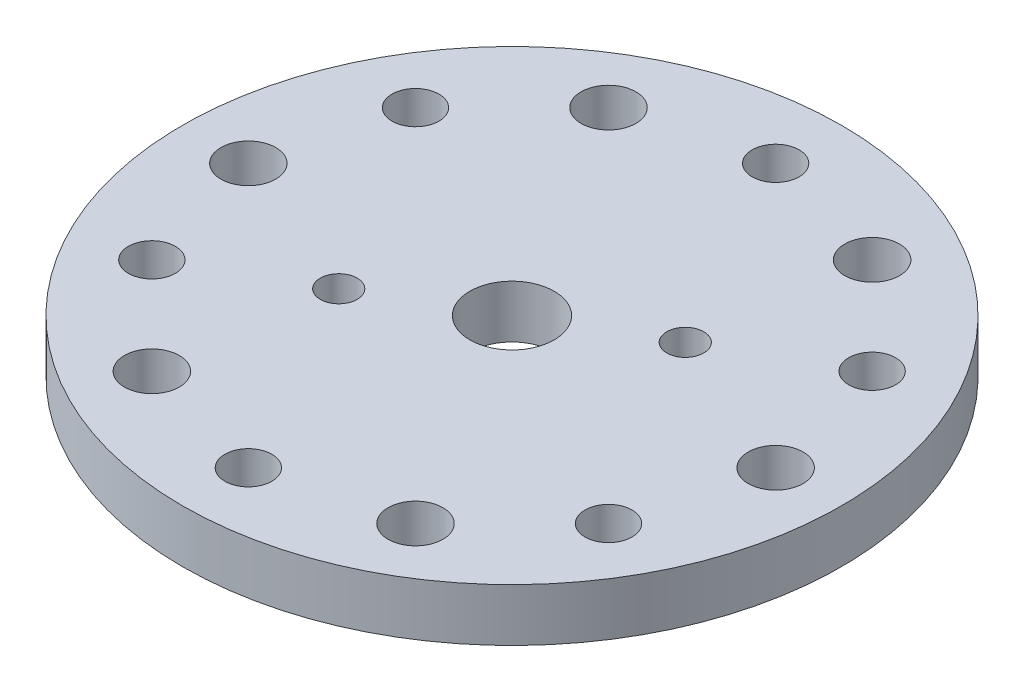
ISO-10303-21;
HEADER;
FILE_DESCRIPTION(('STEP AP214'),'2;1');
FILE_NAME('part.step','',(''),(''),'','','');
FILE_SCHEMA(('AUTOMOTIVE_DESIGN { 1 0 10303 214 1 1 1 1 }'));
ENDSEC;
DATA;
#1=APPLICATION_CONTEXT('core data for automotive mechanical design processes');
#2=APPLICATION_PROTOCOL_DEFINITION('international standard','automotive_design',2000,#1);
#3=PRODUCT_CONTEXT('',#1,'mechanical');
#4=PRODUCT('Part','Part','',(#3));
#5=PRODUCT_RELATED_PRODUCT_CATEGORY('part','',(#4));
#6=PRODUCT_DEFINITION_FORMATION('','',#4);
#7=PRODUCT_DEFINITION_CONTEXT('part definition',#1,'design');
#8=PRODUCT_DEFINITION('design','',#6,#7);
#9=PRODUCT_DEFINITION_SHAPE('','',#8);
#10=(LENGTH_UNIT() NAMED_UNIT(*) SI_UNIT(.MILLI.,.METRE.));
#11=(NAMED_UNIT(*) PLANE_ANGLE_UNIT() SI_UNIT($,.RADIAN.));
#12=(NAMED_UNIT(*) SI_UNIT($,.STERADIAN.) SOLID_ANGLE_UNIT());
#13=UNCERTAINTY_MEASURE_WITH_UNIT(LENGTH_MEASURE(1.E-05),#10,'distance_accuracy_value','');
#14=(GEOMETRIC_REPRESENTATION_CONTEXT(3) GLOBAL_UNCERTAINTY_ASSIGNED_CONTEXT((#13)) GLOBAL_UNIT_ASSIGNED_CONTEXT((#10,
#11,#12)) REPRESENTATION_CONTEXT('',''));
#15=CARTESIAN_POINT('',(0.,0.,0.));
#16=DIRECTION('',(0.,0.,1.));
#17=DIRECTION('',(1.,0.,0.));
#18=AXIS2_PLACEMENT_3D('',#15,#16,#17);
#19=CARTESIAN_POINT('',(0.,2.54,0.));
#20=DIRECTION('',(0.,-1.,0.));
#21=DIRECTION('',(0.,0.,-1.));
#22=AXIS2_PLACEMENT_3D('',#19,#20,#21);
#23=CYLINDRICAL_SURFACE('',#22,15.875);
#24=CARTESIAN_POINT('',(0.,2.54,0.));
#25=DIRECTION('',(0.,1.,0.));
#26=DIRECTION('',(0.,0.,1.));
#27=AXIS2_PLACEMENT_3D('',#24,#25,#26);
#28=CIRCLE('',#27,15.875);
#29=CARTESIAN_POINT('',(0.,2.54,15.875));
#30=VERTEX_POINT('',#29);
#31=EDGE_CURVE('E10',#30,#30,#28,.T.);
#32=ORIENTED_EDGE('',*,*,#31,.F.);
#33=EDGE_LOOP('',(#32));
#34=FACE_BOUND('',#33,.T.);
#35=CARTESIAN_POINT('',(0.,0.,0.));
#36=DIRECTION('',(0.,1.,0.));
#37=DIRECTION('',(0.,0.,1.));
#38=AXIS2_PLACEMENT_3D('',#35,#36,#37);
#39=CIRCLE('',#38,15.875);
#40=CARTESIAN_POINT('',(0.,0.,15.875));
#41=VERTEX_POINT('',#40);
#42=EDGE_CURVE('E37',#41,#41,#39,.T.);
#43=ORIENTED_EDGE('',*,*,#42,.T.);
#44=EDGE_LOOP('',(#43));
#45=FACE_BOUND('',#44,.T.);
#46=ADVANCED_FACE('F34',(#34,#45),#23,.T.);
#47=CARTESIAN_POINT('',(0.,2.54,0.));
#48=DIRECTION('',(0.,1.,0.));
#49=DIRECTION('',(0.,0.,1.));
#50=AXIS2_PLACEMENT_3D('',#47,#48,#49);
#51=PLANE('',#50);
#52=CARTESIAN_POINT('',(5.29141521712292,2.54,-3.055));
#53=DIRECTION('',(0.,1.,0.));
#54=DIRECTION('',(0.,0.,1.));
#55=AXIS2_PLACEMENT_3D('',#52,#53,#54);
#56=CIRCLE('',#55,0.889);
#57=CARTESIAN_POINT('',(5.29141521712292,2.54,-2.166));
#58=VERTEX_POINT('',#57);
#59=EDGE_CURVE('E132',#58,#58,#56,.T.);
#60=ORIENTED_EDGE('',*,*,#59,.F.);
#61=EDGE_LOOP('',(#60));
#62=FACE_BOUND('',#61,.T.);
#63=CARTESIAN_POINT('',(-5.29141521712295,2.54,3.05499999999995));
#64=DIRECTION('',(0.,1.,0.));
#65=DIRECTION('',(0.,0.,1.));
#66=AXIS2_PLACEMENT_3D('',#63,#64,#65);
#67=CIRCLE('',#66,0.889);
#68=CARTESIAN_POINT('',(-5.29141521712295,2.54,3.94399999999995));
#69=VERTEX_POINT('',#68);
#70=EDGE_CURVE('E126',#69,#69,#67,.T.);
#71=ORIENTED_EDGE('',*,*,#70,.F.);
#72=EDGE_LOOP('',(#71));
#73=FACE_BOUND('',#72,.T.);
#74=CARTESIAN_POINT('',(6.35000000000013,2.54,-10.9985226280623));
#75=DIRECTION('',(0.,1.,0.));
#76=DIRECTION('',(0.866025403784433,0.,0.50000000000001));
#77=AXIS2_PLACEMENT_3D('',#74,#75,#76);
#78=CIRCLE('',#77,1.3208);
#79=CARTESIAN_POINT('',(7.49384635331861,2.54,-10.3381226280623));
#80=VERTEX_POINT('',#79);
#81=EDGE_CURVE('E118',#80,#80,#78,.T.);
#82=ORIENTED_EDGE('',*,*,#81,.F.);
#83=EDGE_LOOP('',(#82));
#84=FACE_BOUND('',#83,.T.);
#85=CARTESIAN_POINT('',(-6.3499999999999,2.54,-10.9985226280624));
#86=DIRECTION('',(0.,1.,0.));
#87=DIRECTION('',(0.866025403784443,0.,-0.499999999999992));
#88=AXIS2_PLACEMENT_3D('',#85,#86,#87);
#89=CIRCLE('',#88,1.3208);
#90=CARTESIAN_POINT('',(-5.2061536466814,2.54,-11.6589226280624));
#91=VERTEX_POINT('',#90);
#92=EDGE_CURVE('E112',#91,#91,#89,.T.);
#93=ORIENTED_EDGE('',*,*,#92,.F.);
#94=EDGE_LOOP('',(#93));
#95=FACE_BOUND('',#94,.T.);
#96=CARTESIAN_POINT('',(-12.7,2.54,0.));
#97=DIRECTION('',(0.,1.,0.));
#98=DIRECTION('',(0.,0.,-1.));
#99=AXIS2_PLACEMENT_3D('',#96,#97,#98);
#100=CIRCLE('',#99,1.3208);
#101=CARTESIAN_POINT('',(-12.7,2.54,-1.3208));
#102=VERTEX_POINT('',#101);
#103=EDGE_CURVE('E106',#102,#102,#100,.T.);
#104=ORIENTED_EDGE('',*,*,#103,.F.);
#105=EDGE_LOOP('',(#104));
#106=FACE_BOUND('',#105,.T.);
#107=CARTESIAN_POINT('',(-6.35000000000005,2.54,10.9985226280623));
#108=DIRECTION('',(0.,1.,0.));
#109=DIRECTION('',(-0.866025403784436,0.,-0.500000000000004));
#110=AXIS2_PLACEMENT_3D('',#107,#108,#109);
#111=CIRCLE('',#110,1.3208);
#112=CARTESIAN_POINT('',(-7.49384635331853,2.54,10.3381226280623));
#113=VERTEX_POINT('',#112);
#114=EDGE_CURVE('E100',#113,#113,#111,.T.);
#115=ORIENTED_EDGE('',*,*,#114,.F.);
#116=EDGE_LOOP('',(#115));
#117=FACE_BOUND('',#116,.T.);
#118=CARTESIAN_POINT('',(6.34999999999997,2.54,10.9985226280624));
#119=DIRECTION('',(0.,1.,0.));
#120=DIRECTION('',(-0.86602540378444,0.,0.499999999999998));
#121=AXIS2_PLACEMENT_3D('',#118,#119,#120);
#122=CIRCLE('',#121,1.3208);
#123=CARTESIAN_POINT('',(5.20615364668149,2.54,11.6589226280624));
#124=VERTEX_POINT('',#123);
#125=EDGE_CURVE('E94',#124,#124,#122,.T.);
#126=ORIENTED_EDGE('',*,*,#125,.F.);
#127=EDGE_LOOP('',(#126));
#128=FACE_BOUND('',#127,.T.);
#129=CARTESIAN_POINT('',(12.7,2.54,0.));
#130=DIRECTION('',(0.,1.,0.));
#131=DIRECTION('',(0.,0.,1.));
#132=AXIS2_PLACEMENT_3D('',#129,#130,#131);
#133=CIRCLE('',#132,1.3208);
#134=CARTESIAN_POINT('',(12.7,2.54,1.3208));
#135=VERTEX_POINT('',#134);
#136=EDGE_CURVE('E88',#135,#135,#133,.T.);
#137=ORIENTED_EDGE('',*,*,#136,.F.);
#138=EDGE_LOOP('',(#137));
#139=FACE_BOUND('',#138,.T.);
#140=CARTESIAN_POINT('',(0.,2.54,0.));
#141=DIRECTION('',(0.,1.,0.));
#142=DIRECTION('',(0.,0.,1.));
#143=AXIS2_PLACEMENT_3D('',#140,#141,#142);
#144=CIRCLE('',#143,2.032);
#145=CARTESIAN_POINT('',(0.,2.54,2.032));
#146=VERTEX_POINT('',#145);
#147=EDGE_CURVE('E82',#146,#146,#144,.T.);
#148=ORIENTED_EDGE('',*,*,#147,.F.);
#149=EDGE_LOOP('',(#148));
#150=FACE_BOUND('',#149,.T.);
#151=CARTESIAN_POINT('',(-10.9985226280623,2.54,-6.35000000000013));
#152=DIRECTION('',(0.,1.,0.));
#153=DIRECTION('',(0.,0.,1.));
#154=AXIS2_PLACEMENT_3D('',#151,#152,#153);
#155=CIRCLE('',#154,1.1303);
#156=CARTESIAN_POINT('',(-10.9985226280623,2.54,-5.21970000000013));
#157=VERTEX_POINT('',#156);
#158=EDGE_CURVE('E78',#157,#157,#155,.T.);
#159=ORIENTED_EDGE('',*,*,#158,.F.);
#160=EDGE_LOOP('',(#159));
#161=FACE_BOUND('',#160,.T.);
#162=CARTESIAN_POINT('',(-10.9985226280624,2.54,6.3499999999999));
#163=DIRECTION('',(0.,1.,0.));
#164=DIRECTION('',(0.,0.,1.));
#165=AXIS2_PLACEMENT_3D('',#162,#163,#164);
#166=CIRCLE('',#165,1.1303);
#167=CARTESIAN_POINT('',(-10.9985226280624,2.54,7.4802999999999));
#168=VERTEX_POINT('',#167);
#169=EDGE_CURVE('E72',#168,#168,#166,.T.);
#170=ORIENTED_EDGE('',*,*,#169,.F.);
#171=EDGE_LOOP('',(#170));
#172=FACE_BOUND('',#171,.T.);
#173=CARTESIAN_POINT('',(0.,2.54,12.7));
#174=DIRECTION('',(0.,1.,0.));
#175=DIRECTION('',(0.,0.,1.));
#176=AXIS2_PLACEMENT_3D('',#173,#174,#175);
#177=CIRCLE('',#176,1.1303);
#178=CARTESIAN_POINT('',(0.,2.54,13.8303));
#179=VERTEX_POINT('',#178);
#180=EDGE_CURVE('E66',#179,#179,#177,.T.);
#181=ORIENTED_EDGE('',*,*,#180,.F.);
#182=EDGE_LOOP('',(#181));
#183=FACE_BOUND('',#182,.T.);
#184=CARTESIAN_POINT('',(10.9985226280623,2.54,6.35000000000005));
#185=DIRECTION('',(0.,1.,0.));
#186=DIRECTION('',(0.,0.,1.));
#187=AXIS2_PLACEMENT_3D('',#184,#185,#186);
#188=CIRCLE('',#187,1.1303);
#189=CARTESIAN_POINT('',(10.9985226280623,2.54,7.48030000000005));
#190=VERTEX_POINT('',#189);
#191=EDGE_CURVE('E60',#190,#190,#188,.T.);
#192=ORIENTED_EDGE('',*,*,#191,.F.);
#193=EDGE_LOOP('',(#192));
#194=FACE_BOUND('',#193,.T.);
#195=CARTESIAN_POINT('',(10.9985226280624,2.54,-6.34999999999997));
#196=DIRECTION('',(0.,1.,0.));
#197=DIRECTION('',(0.,0.,1.));
#198=AXIS2_PLACEMENT_3D('',#195,#196,#197);
#199=CIRCLE('',#198,1.1303);
#200=CARTESIAN_POINT('',(10.9985226280624,2.54,-5.21969999999998));
#201=VERTEX_POINT('',#200);
#202=EDGE_CURVE('E54',#201,#201,#199,.T.);
#203=ORIENTED_EDGE('',*,*,#202,.F.);
#204=EDGE_LOOP('',(#203));
#205=FACE_BOUND('',#204,.T.);
#206=CARTESIAN_POINT('',(0.,2.54,-12.7));
#207=DIRECTION('',(0.,1.,0.));
#208=DIRECTION('',(0.,0.,1.));
#209=AXIS2_PLACEMENT_3D('',#206,#207,#208);
#210=CIRCLE('',#209,1.1303);
#211=CARTESIAN_POINT('',(0.,2.54,-11.5697));
#212=VERTEX_POINT('',#211);
#213=EDGE_CURVE('E48',#212,#212,#210,.T.);
#214=ORIENTED_EDGE('',*,*,#213,.F.);
#215=EDGE_LOOP('',(#214));
#216=FACE_BOUND('',#215,.T.);
#217=ORIENTED_EDGE('',*,*,#31,.T.);
#218=EDGE_LOOP('',(#217));
#219=FACE_BOUND('',#218,.T.);
#220=ADVANCED_FACE('F138',(#62,#73,#84,#95,#106,#117,#128,#139,#150,#161,#172,#183,#194,#205,
#216,#219),#51,.T.);
#221=CARTESIAN_POINT('',(0.,0.,0.));
#222=DIRECTION('',(0.,1.,0.));
#223=DIRECTION('',(0.,0.,1.));
#224=AXIS2_PLACEMENT_3D('',#221,#222,#223);
#225=PLANE('',#224);
#226=CARTESIAN_POINT('',(5.29141521712292,0.,-3.055));
#227=DIRECTION('',(0.,1.,0.));
#228=DIRECTION('',(0.,0.,1.));
#229=AXIS2_PLACEMENT_3D('',#226,#227,#228);
#230=CIRCLE('',#229,0.888999999999999);
#231=CARTESIAN_POINT('',(5.29141521712292,0.,-2.166));
#232=VERTEX_POINT('',#231);
#233=EDGE_CURVE('E129',#232,#232,#230,.T.);
#234=ORIENTED_EDGE('',*,*,#233,.T.);
#235=EDGE_LOOP('',(#234));
#236=FACE_BOUND('',#235,.T.);
#237=CARTESIAN_POINT('',(-5.29141521712295,0.,3.05499999999995));
#238=DIRECTION('',(0.,1.,0.));
#239=DIRECTION('',(0.,0.,1.));
#240=AXIS2_PLACEMENT_3D('',#237,#238,#239);
#241=CIRCLE('',#240,0.888999999999999);
#242=CARTESIAN_POINT('',(-5.29141521712295,0.,3.94399999999995));
#243=VERTEX_POINT('',#242);
#244=EDGE_CURVE('E121',#243,#243,#241,.T.);
#245=ORIENTED_EDGE('',*,*,#244,.T.);
#246=EDGE_LOOP('',(#245));
#247=FACE_BOUND('',#246,.T.);
#248=CARTESIAN_POINT('',(6.35000000000013,0.,-10.9985226280623));
#249=DIRECTION('',(0.,1.,0.));
#250=DIRECTION('',(0.866025403784433,0.,0.50000000000001));
#251=AXIS2_PLACEMENT_3D('',#248,#249,#250);
#252=CIRCLE('',#251,1.3208);
#253=CARTESIAN_POINT('',(7.49384635331861,0.,-10.3381226280623));
#254=VERTEX_POINT('',#253);
#255=EDGE_CURVE('E115',#254,#254,#252,.T.);
#256=ORIENTED_EDGE('',*,*,#255,.T.);
#257=EDGE_LOOP('',(#256));
#258=FACE_BOUND('',#257,.T.);
#259=CARTESIAN_POINT('',(-6.3499999999999,0.,-10.9985226280624));
#260=DIRECTION('',(0.,1.,0.));
#261=DIRECTION('',(0.866025403784443,0.,-0.499999999999992));
#262=AXIS2_PLACEMENT_3D('',#259,#260,#261);
#263=CIRCLE('',#262,1.3208);
#264=CARTESIAN_POINT('',(-5.2061536466814,0.,-11.6589226280624));
#265=VERTEX_POINT('',#264);
#266=EDGE_CURVE('E109',#265,#265,#263,.T.);
#267=ORIENTED_EDGE('',*,*,#266,.T.);
#268=EDGE_LOOP('',(#267));
#269=FACE_BOUND('',#268,.T.);
#270=CARTESIAN_POINT('',(-12.7,0.,0.));
#271=DIRECTION('',(0.,1.,0.));
#272=DIRECTION('',(0.,0.,-1.));
#273=AXIS2_PLACEMENT_3D('',#270,#271,#272);
#274=CIRCLE('',#273,1.3208);
#275=CARTESIAN_POINT('',(-12.7,0.,-1.3208));
#276=VERTEX_POINT('',#275);
#277=EDGE_CURVE('E103',#276,#276,#274,.T.);
#278=ORIENTED_EDGE('',*,*,#277,.T.);
#279=EDGE_LOOP('',(#278));
#280=FACE_BOUND('',#279,.T.);
#281=CARTESIAN_POINT('',(-6.35000000000005,0.,10.9985226280623));
#282=DIRECTION('',(0.,1.,0.));
#283=DIRECTION('',(-0.866025403784436,0.,-0.500000000000004));
#284=AXIS2_PLACEMENT_3D('',#281,#282,#283);
#285=CIRCLE('',#284,1.3208);
#286=CARTESIAN_POINT('',(-7.49384635331853,0.,10.3381226280623));
#287=VERTEX_POINT('',#286);
#288=EDGE_CURVE('E97',#287,#287,#285,.T.);
#289=ORIENTED_EDGE('',*,*,#288,.T.);
#290=EDGE_LOOP('',(#289));
#291=FACE_BOUND('',#290,.T.);
#292=CARTESIAN_POINT('',(6.34999999999997,0.,10.9985226280624));
#293=DIRECTION('',(0.,1.,0.));
#294=DIRECTION('',(-0.86602540378444,0.,0.499999999999998));
#295=AXIS2_PLACEMENT_3D('',#292,#293,#294);
#296=CIRCLE('',#295,1.3208);
#297=CARTESIAN_POINT('',(5.20615364668149,0.,11.6589226280624));
#298=VERTEX_POINT('',#297);
#299=EDGE_CURVE('E91',#298,#298,#296,.T.);
#300=ORIENTED_EDGE('',*,*,#299,.T.);
#301=EDGE_LOOP('',(#300));
#302=FACE_BOUND('',#301,.T.);
#303=CARTESIAN_POINT('',(12.7,0.,0.));
#304=DIRECTION('',(0.,1.,0.));
#305=DIRECTION('',(0.,0.,1.));
#306=AXIS2_PLACEMENT_3D('',#303,#304,#305);
#307=CIRCLE('',#306,1.3208);
#308=CARTESIAN_POINT('',(12.7,0.,1.3208));
#309=VERTEX_POINT('',#308);
#310=EDGE_CURVE('E85',#309,#309,#307,.T.);
#311=ORIENTED_EDGE('',*,*,#310,.T.);
#312=EDGE_LOOP('',(#311));
#313=FACE_BOUND('',#312,.T.);
#314=CARTESIAN_POINT('',(0.,0.,0.));
#315=DIRECTION('',(0.,1.,0.));
#316=DIRECTION('',(0.,0.,1.));
#317=AXIS2_PLACEMENT_3D('',#314,#315,#316);
#318=CIRCLE('',#317,2.032);
#319=CARTESIAN_POINT('',(0.,0.,2.032));
#320=VERTEX_POINT('',#319);
#321=EDGE_CURVE('E81',#320,#320,#318,.T.);
#322=ORIENTED_EDGE('',*,*,#321,.T.);
#323=EDGE_LOOP('',(#322));
#324=FACE_BOUND('',#323,.T.);
#325=CARTESIAN_POINT('',(-10.9985226280623,0.,-6.35000000000013));
#326=DIRECTION('',(0.,1.,0.));
#327=DIRECTION('',(0.,0.,1.));
#328=AXIS2_PLACEMENT_3D('',#325,#326,#327);
#329=CIRCLE('',#328,1.1303);
#330=CARTESIAN_POINT('',(-10.9985226280623,0.,-5.21970000000013));
#331=VERTEX_POINT('',#330);
#332=EDGE_CURVE('E75',#331,#331,#329,.T.);
#333=ORIENTED_EDGE('',*,*,#332,.T.);
#334=EDGE_LOOP('',(#333));
#335=FACE_BOUND('',#334,.T.);
#336=CARTESIAN_POINT('',(-10.9985226280624,0.,6.3499999999999));
#337=DIRECTION('',(0.,1.,0.));
#338=DIRECTION('',(0.,0.,1.));
#339=AXIS2_PLACEMENT_3D('',#336,#337,#338);
#340=CIRCLE('',#339,1.1303);
#341=CARTESIAN_POINT('',(-10.9985226280624,0.,7.4802999999999));
#342=VERTEX_POINT('',#341);
#343=EDGE_CURVE('E69',#342,#342,#340,.T.);
#344=ORIENTED_EDGE('',*,*,#343,.T.);
#345=EDGE_LOOP('',(#344));
#346=FACE_BOUND('',#345,.T.);
#347=CARTESIAN_POINT('',(0.,0.,12.7));
#348=DIRECTION('',(0.,1.,0.));
#349=DIRECTION('',(0.,0.,1.));
#350=AXIS2_PLACEMENT_3D('',#347,#348,#349);
#351=CIRCLE('',#350,1.1303);
#352=CARTESIAN_POINT('',(0.,0.,13.8303));
#353=VERTEX_POINT('',#352);
#354=EDGE_CURVE('E63',#353,#353,#351,.T.);
#355=ORIENTED_EDGE('',*,*,#354,.T.);
#356=EDGE_LOOP('',(#355));
#357=FACE_BOUND('',#356,.T.);
#358=CARTESIAN_POINT('',(10.9985226280623,0.,6.35000000000005));
#359=DIRECTION('',(0.,1.,0.));
#360=DIRECTION('',(0.,0.,1.));
#361=AXIS2_PLACEMENT_3D('',#358,#359,#360);
#362=CIRCLE('',#361,1.1303);
#363=CARTESIAN_POINT('',(10.9985226280623,0.,7.48030000000005));
#364=VERTEX_POINT('',#363);
#365=EDGE_CURVE('E57',#364,#364,#362,.T.);
#366=ORIENTED_EDGE('',*,*,#365,.T.);
#367=EDGE_LOOP('',(#366));
#368=FACE_BOUND('',#367,.T.);
#369=CARTESIAN_POINT('',(10.9985226280624,0.,-6.34999999999997));
#370=DIRECTION('',(0.,1.,0.));
#371=DIRECTION('',(0.,0.,1.));
#372=AXIS2_PLACEMENT_3D('',#369,#370,#371);
#373=CIRCLE('',#372,1.1303);
#374=CARTESIAN_POINT('',(10.9985226280624,0.,-5.21969999999998));
#375=VERTEX_POINT('',#374);
#376=EDGE_CURVE('E51',#375,#375,#373,.T.);
#377=ORIENTED_EDGE('',*,*,#376,.T.);
#378=EDGE_LOOP('',(#377));
#379=FACE_BOUND('',#378,.T.);
#380=CARTESIAN_POINT('',(0.,0.,-12.7));
#381=DIRECTION('',(0.,1.,0.));
#382=DIRECTION('',(0.,0.,1.));
#383=AXIS2_PLACEMENT_3D('',#380,#381,#382);
#384=CIRCLE('',#383,1.1303);
#385=CARTESIAN_POINT('',(0.,0.,-11.5697));
#386=VERTEX_POINT('',#385);
#387=EDGE_CURVE('E44',#386,#386,#384,.T.);
#388=ORIENTED_EDGE('',*,*,#387,.T.);
#389=EDGE_LOOP('',(#388));
#390=FACE_BOUND('',#389,.T.);
#391=ORIENTED_EDGE('',*,*,#42,.F.);
#392=EDGE_LOOP('',(#391));
#393=FACE_BOUND('',#392,.T.);
#394=ADVANCED_FACE('F141',(#236,#247,#258,#269,#280,#291,#302,#313,#324,#335,#346,#357,#368,
#379,#390,#393),#225,.F.);
#395=CARTESIAN_POINT('',(0.,2.54,-12.7));
#396=DIRECTION('',(0.,1.,0.));
#397=DIRECTION('',(0.,0.,1.));
#398=AXIS2_PLACEMENT_3D('',#395,#396,#397);
#399=CYLINDRICAL_SURFACE('',#398,1.1303);
#400=ORIENTED_EDGE('',*,*,#387,.F.);
#401=EDGE_LOOP('',(#400));
#402=FACE_BOUND('',#401,.T.);
#403=ORIENTED_EDGE('',*,*,#213,.T.);
#404=EDGE_LOOP('',(#403));
#405=FACE_BOUND('',#404,.T.);
#406=ADVANCED_FACE('F171',(#402,#405),#399,.F.);
#407=CARTESIAN_POINT('',(10.9985226280624,2.54,-6.34999999999997));
#408=DIRECTION('',(0.,1.,0.));
#409=DIRECTION('',(0.,0.,1.));
#410=AXIS2_PLACEMENT_3D('',#407,#408,#409);
#411=CYLINDRICAL_SURFACE('',#410,1.1303);
#412=ORIENTED_EDGE('',*,*,#376,.F.);
#413=EDGE_LOOP('',(#412));
#414=FACE_BOUND('',#413,.T.);
#415=ORIENTED_EDGE('',*,*,#202,.T.);
#416=EDGE_LOOP('',(#415));
#417=FACE_BOUND('',#416,.T.);
#418=ADVANCED_FACE('F173',(#414,#417),#411,.F.);
#419=CARTESIAN_POINT('',(10.9985226280623,2.54,6.35000000000005));
#420=DIRECTION('',(0.,1.,0.));
#421=DIRECTION('',(0.,0.,1.));
#422=AXIS2_PLACEMENT_3D('',#419,#420,#421);
#423=CYLINDRICAL_SURFACE('',#422,1.1303);
#424=ORIENTED_EDGE('',*,*,#365,.F.);
#425=EDGE_LOOP('',(#424));
#426=FACE_BOUND('',#425,.T.);
#427=ORIENTED_EDGE('',*,*,#191,.T.);
#428=EDGE_LOOP('',(#427));
#429=FACE_BOUND('',#428,.T.);
#430=ADVANCED_FACE('F180',(#426,#429),#423,.F.);
#431=CARTESIAN_POINT('',(0.,2.54,12.7));
#432=DIRECTION('',(0.,1.,0.));
#433=DIRECTION('',(0.,0.,1.));
#434=AXIS2_PLACEMENT_3D('',#431,#432,#433);
#435=CYLINDRICAL_SURFACE('',#434,1.1303);
#436=ORIENTED_EDGE('',*,*,#354,.F.);
#437=EDGE_LOOP('',(#436));
#438=FACE_BOUND('',#437,.T.);
#439=ORIENTED_EDGE('',*,*,#180,.T.);
#440=EDGE_LOOP('',(#439));
#441=FACE_BOUND('',#440,.T.);
#442=ADVANCED_FACE('F307',(#438,#441),#435,.F.);
#443=CARTESIAN_POINT('',(-10.9985226280624,2.54,6.3499999999999));
#444=DIRECTION('',(0.,1.,0.));
#445=DIRECTION('',(0.,0.,1.));
#446=AXIS2_PLACEMENT_3D('',#443,#444,#445);
#447=CYLINDRICAL_SURFACE('',#446,1.1303);
#448=ORIENTED_EDGE('',*,*,#343,.F.);
#449=EDGE_LOOP('',(#448));
#450=FACE_BOUND('',#449,.T.);
#451=ORIENTED_EDGE('',*,*,#169,.T.);
#452=EDGE_LOOP('',(#451));
#453=FACE_BOUND('',#452,.T.);
#454=ADVANCED_FACE('F299',(#450,#453),#447,.F.);
#455=CARTESIAN_POINT('',(-10.9985226280623,2.54,-6.35000000000013));
#456=DIRECTION('',(0.,1.,0.));
#457=DIRECTION('',(0.,0.,1.));
#458=AXIS2_PLACEMENT_3D('',#455,#456,#457);
#459=CYLINDRICAL_SURFACE('',#458,1.1303);
#460=ORIENTED_EDGE('',*,*,#332,.F.);
#461=EDGE_LOOP('',(#460));
#462=FACE_BOUND('',#461,.T.);
#463=ORIENTED_EDGE('',*,*,#158,.T.);
#464=EDGE_LOOP('',(#463));
#465=FACE_BOUND('',#464,.T.);
#466=ADVANCED_FACE('F291',(#462,#465),#459,.F.);
#467=CARTESIAN_POINT('',(0.,0.,0.));
#468=DIRECTION('',(0.,1.,0.));
#469=DIRECTION('',(0.,0.,1.));
#470=AXIS2_PLACEMENT_3D('',#467,#468,#469);
#471=CYLINDRICAL_SURFACE('',#470,2.032);
#472=ORIENTED_EDGE('',*,*,#321,.F.);
#473=EDGE_LOOP('',(#472));
#474=FACE_BOUND('',#473,.T.);
#475=ORIENTED_EDGE('',*,*,#147,.T.);
#476=EDGE_LOOP('',(#475));
#477=FACE_BOUND('',#476,.T.);
#478=ADVANCED_FACE('F283',(#474,#477),#471,.F.);
#479=CARTESIAN_POINT('',(12.7,0.,0.));
#480=DIRECTION('',(0.,1.,0.));
#481=DIRECTION('',(0.,0.,1.));
#482=AXIS2_PLACEMENT_3D('',#479,#480,#481);
#483=CYLINDRICAL_SURFACE('',#482,1.3208);
#484=ORIENTED_EDGE('',*,*,#310,.F.);
#485=EDGE_LOOP('',(#484));
#486=FACE_BOUND('',#485,.T.);
#487=ORIENTED_EDGE('',*,*,#136,.T.);
#488=EDGE_LOOP('',(#487));
#489=FACE_BOUND('',#488,.T.);
#490=ADVANCED_FACE('F275',(#486,#489),#483,.F.);
#491=CARTESIAN_POINT('',(6.34999999999997,0.,10.9985226280624));
#492=DIRECTION('',(0.,1.,0.));
#493=DIRECTION('',(0.,0.,1.));
#494=AXIS2_PLACEMENT_3D('',#491,#492,#493);
#495=CYLINDRICAL_SURFACE('',#494,1.3208);
#496=ORIENTED_EDGE('',*,*,#299,.F.);
#497=EDGE_LOOP('',(#496));
#498=FACE_BOUND('',#497,.T.);
#499=ORIENTED_EDGE('',*,*,#125,.T.);
#500=EDGE_LOOP('',(#499));
#501=FACE_BOUND('',#500,.T.);
#502=ADVANCED_FACE('F267',(#498,#501),#495,.F.);
#503=CARTESIAN_POINT('',(-6.35000000000005,0.,10.9985226280623));
#504=DIRECTION('',(0.,1.,0.));
#505=DIRECTION('',(0.,0.,1.));
#506=AXIS2_PLACEMENT_3D('',#503,#504,#505);
#507=CYLINDRICAL_SURFACE('',#506,1.3208);
#508=ORIENTED_EDGE('',*,*,#288,.F.);
#509=EDGE_LOOP('',(#508));
#510=FACE_BOUND('',#509,.T.);
#511=ORIENTED_EDGE('',*,*,#114,.T.);
#512=EDGE_LOOP('',(#511));
#513=FACE_BOUND('',#512,.T.);
#514=ADVANCED_FACE('F259',(#510,#513),#507,.F.);
#515=CARTESIAN_POINT('',(-12.7,0.,0.));
#516=DIRECTION('',(0.,1.,0.));
#517=DIRECTION('',(0.,0.,1.));
#518=AXIS2_PLACEMENT_3D('',#515,#516,#517);
#519=CYLINDRICAL_SURFACE('',#518,1.3208);
#520=ORIENTED_EDGE('',*,*,#277,.F.);
#521=EDGE_LOOP('',(#520));
#522=FACE_BOUND('',#521,.T.);
#523=ORIENTED_EDGE('',*,*,#103,.T.);
#524=EDGE_LOOP('',(#523));
#525=FACE_BOUND('',#524,.T.);
#526=ADVANCED_FACE('F251',(#522,#525),#519,.F.);
#527=CARTESIAN_POINT('',(-6.3499999999999,0.,-10.9985226280624));
#528=DIRECTION('',(0.,1.,0.));
#529=DIRECTION('',(0.,0.,1.));
#530=AXIS2_PLACEMENT_3D('',#527,#528,#529);
#531=CYLINDRICAL_SURFACE('',#530,1.3208);
#532=ORIENTED_EDGE('',*,*,#266,.F.);
#533=EDGE_LOOP('',(#532));
#534=FACE_BOUND('',#533,.T.);
#535=ORIENTED_EDGE('',*,*,#92,.T.);
#536=EDGE_LOOP('',(#535));
#537=FACE_BOUND('',#536,.T.);
#538=ADVANCED_FACE('F243',(#534,#537),#531,.F.);
#539=CARTESIAN_POINT('',(6.35000000000013,0.,-10.9985226280623));
#540=DIRECTION('',(0.,1.,0.));
#541=DIRECTION('',(0.,0.,1.));
#542=AXIS2_PLACEMENT_3D('',#539,#540,#541);
#543=CYLINDRICAL_SURFACE('',#542,1.3208);
#544=ORIENTED_EDGE('',*,*,#255,.F.);
#545=EDGE_LOOP('',(#544));
#546=FACE_BOUND('',#545,.T.);
#547=ORIENTED_EDGE('',*,*,#81,.T.);
#548=EDGE_LOOP('',(#547));
#549=FACE_BOUND('',#548,.T.);
#550=ADVANCED_FACE('F223',(#546,#549),#543,.F.);
#551=CARTESIAN_POINT('',(-5.29141521712295,2.54,3.05499999999995));
#552=DIRECTION('',(0.,1.,0.));
#553=DIRECTION('',(0.,0.,1.));
#554=AXIS2_PLACEMENT_3D('',#551,#552,#553);
#555=CYLINDRICAL_SURFACE('',#554,0.889);
#556=ORIENTED_EDGE('',*,*,#244,.F.);
#557=EDGE_LOOP('',(#556));
#558=FACE_BOUND('',#557,.T.);
#559=ORIENTED_EDGE('',*,*,#70,.T.);
#560=EDGE_LOOP('',(#559));
#561=FACE_BOUND('',#560,.T.);
#562=ADVANCED_FACE('F211',(#558,#561),#555,.F.);
#563=CARTESIAN_POINT('',(5.29141521712292,2.54,-3.055));
#564=DIRECTION('',(0.,1.,0.));
#565=DIRECTION('',(0.,0.,1.));
#566=AXIS2_PLACEMENT_3D('',#563,#564,#565);
#567=CYLINDRICAL_SURFACE('',#566,0.889);
#568=ORIENTED_EDGE('',*,*,#233,.F.);
#569=EDGE_LOOP('',(#568));
#570=FACE_BOUND('',#569,.T.);
#571=ORIENTED_EDGE('',*,*,#59,.T.);
#572=EDGE_LOOP('',(#571));
#573=FACE_BOUND('',#572,.T.);
#574=ADVANCED_FACE('F136',(#570,#573),#567,.F.);
#575=CLOSED_SHELL('',(#46,#220,#394,#406,#418,#430,#442,#454,#466,#478,#490,#502,#514,#526,#538,
#550,#562,#574));
#576=MANIFOLD_SOLID_BREP('B2',#575);
#577=ADVANCED_BREP_SHAPE_REPRESENTATION('',(#18,#576),#14);
#578=SHAPE_DEFINITION_REPRESENTATION(#9,#577);
ENDSEC;
END-ISO-10303-21;
